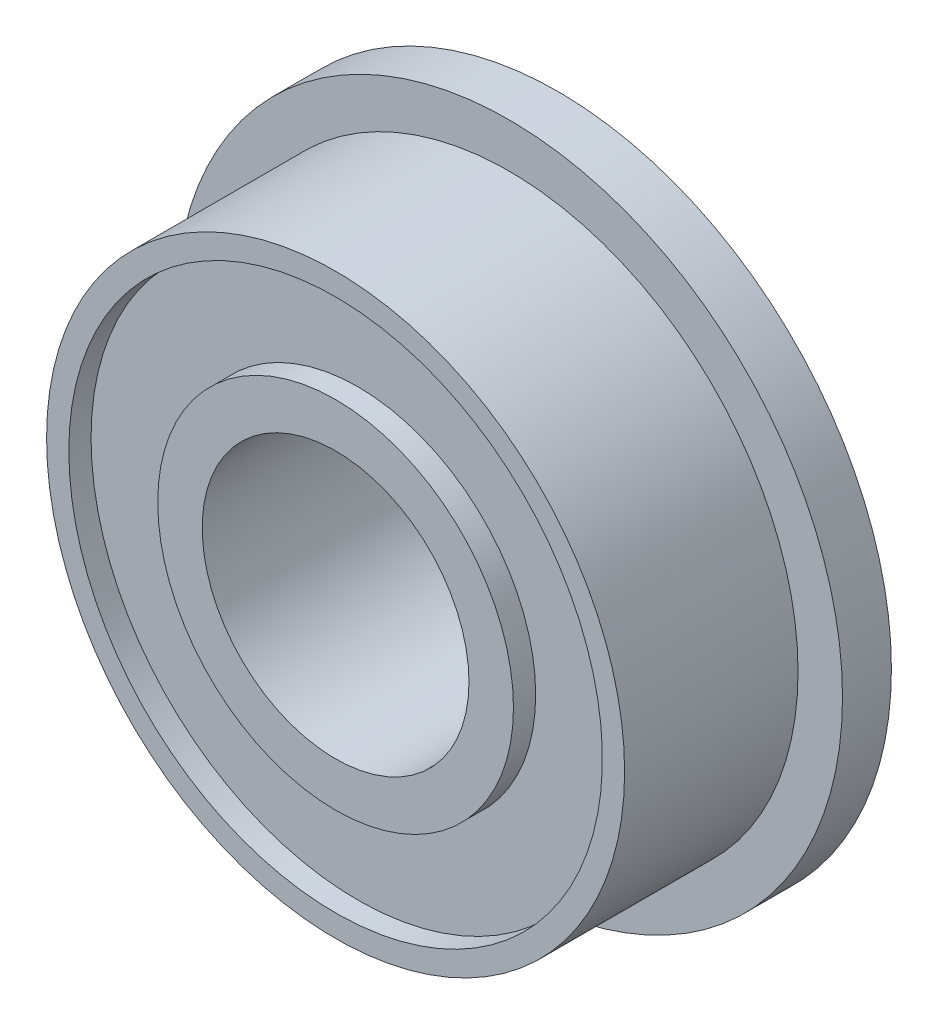
ISO-10303-21;
HEADER;
FILE_DESCRIPTION(('STEP AP214'),'2;1');
FILE_NAME('part.step','',(''),(''),'','','');
FILE_SCHEMA(('AUTOMOTIVE_DESIGN { 1 0 10303 214 1 1 1 1 }'));
ENDSEC;
DATA;
#1=APPLICATION_CONTEXT('core data for automotive mechanical design processes');
#2=APPLICATION_PROTOCOL_DEFINITION('international standard','automotive_design',2000,#1);
#3=PRODUCT_CONTEXT('',#1,'mechanical');
#4=PRODUCT('Part','Part','',(#3));
#5=PRODUCT_RELATED_PRODUCT_CATEGORY('part','',(#4));
#6=PRODUCT_DEFINITION_FORMATION('','',#4);
#7=PRODUCT_DEFINITION_CONTEXT('part definition',#1,'design');
#8=PRODUCT_DEFINITION('design','',#6,#7);
#9=PRODUCT_DEFINITION_SHAPE('','',#8);
#10=(LENGTH_UNIT() NAMED_UNIT(*) SI_UNIT(.MILLI.,.METRE.));
#11=(NAMED_UNIT(*) PLANE_ANGLE_UNIT() SI_UNIT($,.RADIAN.));
#12=(NAMED_UNIT(*) SI_UNIT($,.STERADIAN.) SOLID_ANGLE_UNIT());
#13=UNCERTAINTY_MEASURE_WITH_UNIT(LENGTH_MEASURE(1.E-05),#10,'distance_accuracy_value','');
#14=(GEOMETRIC_REPRESENTATION_CONTEXT(3) GLOBAL_UNCERTAINTY_ASSIGNED_CONTEXT((#13)) GLOBAL_UNIT_ASSIGNED_CONTEXT((#10,
#11,#12)) REPRESENTATION_CONTEXT('',''));
#15=CARTESIAN_POINT('',(0.,0.,0.));
#16=DIRECTION('',(0.,0.,1.));
#17=DIRECTION('',(1.,0.,0.));
#18=AXIS2_PLACEMENT_3D('',#15,#16,#17);
#19=CARTESIAN_POINT('',(0.,0.,5.));
#20=DIRECTION('',(0.,0.,1.));
#21=DIRECTION('',(1.,0.,0.));
#22=AXIS2_PLACEMENT_3D('',#19,#20,#21);
#23=PLANE('',#22);
#24=CARTESIAN_POINT('',(0.,0.,5.));
#25=DIRECTION('',(0.,0.,1.));
#26=DIRECTION('',(1.,0.,0.));
#27=AXIS2_PLACEMENT_3D('',#24,#25,#26);
#28=CIRCLE('',#27,3.);
#29=CARTESIAN_POINT('',(3.,0.,5.));
#30=VERTEX_POINT('',#29);
#31=EDGE_CURVE('E59',#30,#30,#28,.T.);
#32=ORIENTED_EDGE('',*,*,#31,.F.);
#33=EDGE_LOOP('',(#32));
#34=FACE_BOUND('',#33,.T.);
#35=CARTESIAN_POINT('',(0.,0.,5.));
#36=DIRECTION('',(0.,0.,-1.));
#37=DIRECTION('',(-1.,0.,0.));
#38=AXIS2_PLACEMENT_3D('',#35,#36,#37);
#39=CIRCLE('',#38,4.);
#40=CARTESIAN_POINT('',(-4.,0.,5.));
#41=VERTEX_POINT('',#40);
#42=EDGE_CURVE('E85',#41,#41,#39,.T.);
#43=ORIENTED_EDGE('',*,*,#42,.F.);
#44=EDGE_LOOP('',(#43));
#45=FACE_BOUND('',#44,.T.);
#46=ADVANCED_FACE('F36',(#34,#45),#23,.T.);
#47=CARTESIAN_POINT('',(0.,0.,0.));
#48=DIRECTION('',(0.,0.,1.));
#49=DIRECTION('',(1.,0.,0.));
#50=AXIS2_PLACEMENT_3D('',#47,#48,#49);
#51=PLANE('',#50);
#52=CARTESIAN_POINT('',(0.,0.,0.));
#53=DIRECTION('',(0.,0.,1.));
#54=DIRECTION('',(1.,0.,0.));
#55=AXIS2_PLACEMENT_3D('',#52,#53,#54);
#56=CIRCLE('',#55,3.);
#57=CARTESIAN_POINT('',(3.,0.,0.));
#58=VERTEX_POINT('',#57);
#59=EDGE_CURVE('E53',#58,#58,#56,.T.);
#60=ORIENTED_EDGE('',*,*,#59,.T.);
#61=EDGE_LOOP('',(#60));
#62=FACE_BOUND('',#61,.T.);
#63=CARTESIAN_POINT('',(0.,0.,0.));
#64=DIRECTION('',(0.,0.,-1.));
#65=DIRECTION('',(-1.,0.,0.));
#66=AXIS2_PLACEMENT_3D('',#63,#64,#65);
#67=CIRCLE('',#66,4.);
#68=CARTESIAN_POINT('',(-4.,0.,0.));
#69=VERTEX_POINT('',#68);
#70=EDGE_CURVE('E73',#69,#69,#67,.T.);
#71=ORIENTED_EDGE('',*,*,#70,.T.);
#72=EDGE_LOOP('',(#71));
#73=FACE_BOUND('',#72,.T.);
#74=ADVANCED_FACE('F101',(#62,#73),#51,.F.);
#75=CARTESIAN_POINT('',(0.,0.,1.1));
#76=DIRECTION('',(0.,0.,1.));
#77=DIRECTION('',(1.,0.,0.));
#78=AXIS2_PLACEMENT_3D('',#75,#76,#77);
#79=PLANE('',#78);
#80=CARTESIAN_POINT('',(0.,0.,1.1));
#81=DIRECTION('',(0.,0.,1.));
#82=DIRECTION('',(1.,0.,0.));
#83=AXIS2_PLACEMENT_3D('',#80,#81,#82);
#84=CIRCLE('',#83,6.5);
#85=CARTESIAN_POINT('',(6.5,0.,1.1));
#86=VERTEX_POINT('',#85);
#87=EDGE_CURVE('E10',#86,#86,#84,.T.);
#88=ORIENTED_EDGE('',*,*,#87,.F.);
#89=EDGE_LOOP('',(#88));
#90=FACE_BOUND('',#89,.T.);
#91=CARTESIAN_POINT('',(0.,0.,1.1));
#92=DIRECTION('',(0.,0.,1.));
#93=DIRECTION('',(1.,0.,0.));
#94=AXIS2_PLACEMENT_3D('',#91,#92,#93);
#95=CIRCLE('',#94,7.5);
#96=CARTESIAN_POINT('',(7.5,0.,1.1));
#97=VERTEX_POINT('',#96);
#98=EDGE_CURVE('E44',#97,#97,#95,.T.);
#99=ORIENTED_EDGE('',*,*,#98,.T.);
#100=EDGE_LOOP('',(#99));
#101=FACE_BOUND('',#100,.T.);
#102=ADVANCED_FACE('F108',(#90,#101),#79,.T.);
#103=CARTESIAN_POINT('',(0.,0.,0.));
#104=DIRECTION('',(0.,0.,-1.));
#105=DIRECTION('',(-1.,0.,0.));
#106=AXIS2_PLACEMENT_3D('',#103,#104,#105);
#107=CIRCLE('',#106,6.);
#108=CARTESIAN_POINT('',(-6.,0.,0.));
#109=VERTEX_POINT('',#108);
#110=EDGE_CURVE('E67',#109,#109,#107,.T.);
#111=ORIENTED_EDGE('',*,*,#110,.F.);
#112=EDGE_LOOP('',(#111));
#113=FACE_BOUND('',#112,.T.);
#114=CARTESIAN_POINT('',(0.,0.,0.));
#115=DIRECTION('',(0.,0.,1.));
#116=DIRECTION('',(1.,0.,0.));
#117=AXIS2_PLACEMENT_3D('',#114,#115,#116);
#118=CIRCLE('',#117,7.5);
#119=CARTESIAN_POINT('',(7.5,0.,0.));
#120=VERTEX_POINT('',#119);
#121=EDGE_CURVE('E40',#120,#120,#118,.T.);
#122=ORIENTED_EDGE('',*,*,#121,.F.);
#123=EDGE_LOOP('',(#122));
#124=FACE_BOUND('',#123,.T.);
#125=ADVANCED_FACE('F109',(#113,#124),#51,.F.);
#126=CARTESIAN_POINT('',(0.,0.,1.1));
#127=DIRECTION('',(0.,0.,-1.));
#128=DIRECTION('',(-1.,0.,0.));
#129=AXIS2_PLACEMENT_3D('',#126,#127,#128);
#130=CYLINDRICAL_SURFACE('',#129,7.5);
#131=ORIENTED_EDGE('',*,*,#98,.F.);
#132=EDGE_LOOP('',(#131));
#133=FACE_BOUND('',#132,.T.);
#134=ORIENTED_EDGE('',*,*,#121,.T.);
#135=EDGE_LOOP('',(#134));
#136=FACE_BOUND('',#135,.T.);
#137=ADVANCED_FACE('F38',(#133,#136),#130,.T.);
#138=CARTESIAN_POINT('',(0.,0.,1.1));
#139=DIRECTION('',(0.,0.,-1.));
#140=DIRECTION('',(-1.,0.,0.));
#141=AXIS2_PLACEMENT_3D('',#138,#139,#140);
#142=CYLINDRICAL_SURFACE('',#141,3.);
#143=ORIENTED_EDGE('',*,*,#59,.F.);
#144=EDGE_LOOP('',(#143));
#145=FACE_BOUND('',#144,.T.);
#146=ORIENTED_EDGE('',*,*,#31,.T.);
#147=EDGE_LOOP('',(#146));
#148=FACE_BOUND('',#147,.T.);
#149=ADVANCED_FACE('F114',(#145,#148),#142,.F.);
#150=CARTESIAN_POINT('',(0.,0.,5.));
#151=DIRECTION('',(0.,0.,-1.));
#152=DIRECTION('',(-1.,0.,0.));
#153=AXIS2_PLACEMENT_3D('',#150,#151,#152);
#154=CIRCLE('',#153,6.);
#155=CARTESIAN_POINT('',(-6.,0.,5.));
#156=VERTEX_POINT('',#155);
#157=EDGE_CURVE('E79',#156,#156,#154,.T.);
#158=ORIENTED_EDGE('',*,*,#157,.T.);
#159=EDGE_LOOP('',(#158));
#160=FACE_BOUND('',#159,.T.);
#161=CARTESIAN_POINT('',(0.,0.,5.));
#162=DIRECTION('',(0.,0.,1.));
#163=DIRECTION('',(1.,0.,0.));
#164=AXIS2_PLACEMENT_3D('',#161,#162,#163);
#165=CIRCLE('',#164,6.5);
#166=CARTESIAN_POINT('',(6.5,0.,5.));
#167=VERTEX_POINT('',#166);
#168=EDGE_CURVE('E51',#167,#167,#165,.T.);
#169=ORIENTED_EDGE('',*,*,#168,.T.);
#170=EDGE_LOOP('',(#169));
#171=FACE_BOUND('',#170,.T.);
#172=ADVANCED_FACE('F104',(#160,#171),#23,.T.);
#173=CARTESIAN_POINT('',(0.,0.,5.));
#174=DIRECTION('',(0.,0.,-1.));
#175=DIRECTION('',(-1.,0.,0.));
#176=AXIS2_PLACEMENT_3D('',#173,#174,#175);
#177=CYLINDRICAL_SURFACE('',#176,6.5);
#178=ORIENTED_EDGE('',*,*,#168,.F.);
#179=EDGE_LOOP('',(#178));
#180=FACE_BOUND('',#179,.T.);
#181=ORIENTED_EDGE('',*,*,#87,.T.);
#182=EDGE_LOOP('',(#181));
#183=FACE_BOUND('',#182,.T.);
#184=ADVANCED_FACE('F113',(#180,#183),#177,.T.);
#185=CARTESIAN_POINT('',(0.,0.,0.5));
#186=DIRECTION('',(0.,0.,-1.));
#187=DIRECTION('',(-1.,0.,0.));
#188=AXIS2_PLACEMENT_3D('',#185,#186,#187);
#189=CYLINDRICAL_SURFACE('',#188,6.);
#190=CARTESIAN_POINT('',(0.,0.,0.5));
#191=DIRECTION('',(0.,0.,-1.));
#192=DIRECTION('',(-1.,0.,0.));
#193=AXIS2_PLACEMENT_3D('',#190,#191,#192);
#194=CIRCLE('',#193,6.);
#195=CARTESIAN_POINT('',(-6.,0.,0.5));
#196=VERTEX_POINT('',#195);
#197=EDGE_CURVE('E63',#196,#196,#194,.T.);
#198=ORIENTED_EDGE('',*,*,#197,.F.);
#199=EDGE_LOOP('',(#198));
#200=FACE_BOUND('',#199,.T.);
#201=ORIENTED_EDGE('',*,*,#110,.T.);
#202=EDGE_LOOP('',(#201));
#203=FACE_BOUND('',#202,.T.);
#204=ADVANCED_FACE('F120',(#200,#203),#189,.F.);
#205=CARTESIAN_POINT('',(0.,0.,0.5));
#206=DIRECTION('',(0.,0.,-1.));
#207=DIRECTION('',(-1.,0.,0.));
#208=AXIS2_PLACEMENT_3D('',#205,#206,#207);
#209=PLANE('',#208);
#210=CARTESIAN_POINT('',(0.,0.,0.5));
#211=DIRECTION('',(0.,0.,-1.));
#212=DIRECTION('',(-1.,0.,0.));
#213=AXIS2_PLACEMENT_3D('',#210,#211,#212);
#214=CIRCLE('',#213,4.);
#215=CARTESIAN_POINT('',(-4.,0.,0.5));
#216=VERTEX_POINT('',#215);
#217=EDGE_CURVE('E71',#216,#216,#214,.T.);
#218=ORIENTED_EDGE('',*,*,#217,.F.);
#219=EDGE_LOOP('',(#218));
#220=FACE_BOUND('',#219,.T.);
#221=ORIENTED_EDGE('',*,*,#197,.T.);
#222=EDGE_LOOP('',(#221));
#223=FACE_BOUND('',#222,.T.);
#224=ADVANCED_FACE('F138',(#220,#223),#209,.T.);
#225=CARTESIAN_POINT('',(0.,0.,0.5));
#226=DIRECTION('',(0.,0.,-1.));
#227=DIRECTION('',(-1.,0.,0.));
#228=AXIS2_PLACEMENT_3D('',#225,#226,#227);
#229=CYLINDRICAL_SURFACE('',#228,4.);
#230=ORIENTED_EDGE('',*,*,#217,.T.);
#231=EDGE_LOOP('',(#230));
#232=FACE_BOUND('',#231,.T.);
#233=ORIENTED_EDGE('',*,*,#70,.F.);
#234=EDGE_LOOP('',(#233));
#235=FACE_BOUND('',#234,.T.);
#236=ADVANCED_FACE('F132',(#232,#235),#229,.T.);
#237=CARTESIAN_POINT('',(0.,0.,4.5));
#238=DIRECTION('',(0.,0.,1.));
#239=DIRECTION('',(-1.,0.,0.));
#240=AXIS2_PLACEMENT_3D('',#237,#238,#239);
#241=PLANE('',#240);
#242=CARTESIAN_POINT('',(0.,0.,4.5));
#243=DIRECTION('',(0.,0.,-1.));
#244=DIRECTION('',(-1.,0.,0.));
#245=AXIS2_PLACEMENT_3D('',#242,#243,#244);
#246=CIRCLE('',#245,6.);
#247=CARTESIAN_POINT('',(-6.,0.,4.5));
#248=VERTEX_POINT('',#247);
#249=EDGE_CURVE('E76',#248,#248,#246,.T.);
#250=ORIENTED_EDGE('',*,*,#249,.F.);
#251=EDGE_LOOP('',(#250));
#252=FACE_BOUND('',#251,.T.);
#253=CARTESIAN_POINT('',(0.,0.,4.5));
#254=DIRECTION('',(0.,0.,-1.));
#255=DIRECTION('',(-1.,0.,0.));
#256=AXIS2_PLACEMENT_3D('',#253,#254,#255);
#257=CIRCLE('',#256,4.);
#258=CARTESIAN_POINT('',(-4.,0.,4.5));
#259=VERTEX_POINT('',#258);
#260=EDGE_CURVE('E82',#259,#259,#257,.T.);
#261=ORIENTED_EDGE('',*,*,#260,.T.);
#262=EDGE_LOOP('',(#261));
#263=FACE_BOUND('',#262,.T.);
#264=ADVANCED_FACE('F91',(#252,#263),#241,.T.);
#265=CARTESIAN_POINT('',(0.,0.,4.5));
#266=DIRECTION('',(0.,0.,1.));
#267=DIRECTION('',(1.,0.,0.));
#268=AXIS2_PLACEMENT_3D('',#265,#266,#267);
#269=CYLINDRICAL_SURFACE('',#268,6.);
#270=ORIENTED_EDGE('',*,*,#249,.T.);
#271=EDGE_LOOP('',(#270));
#272=FACE_BOUND('',#271,.T.);
#273=ORIENTED_EDGE('',*,*,#157,.F.);
#274=EDGE_LOOP('',(#273));
#275=FACE_BOUND('',#274,.T.);
#276=ADVANCED_FACE('F96',(#272,#275),#269,.F.);
#277=CARTESIAN_POINT('',(0.,0.,4.5));
#278=DIRECTION('',(0.,0.,1.));
#279=DIRECTION('',(1.,0.,0.));
#280=AXIS2_PLACEMENT_3D('',#277,#278,#279);
#281=CYLINDRICAL_SURFACE('',#280,4.);
#282=ORIENTED_EDGE('',*,*,#260,.F.);
#283=EDGE_LOOP('',(#282));
#284=FACE_BOUND('',#283,.T.);
#285=ORIENTED_EDGE('',*,*,#42,.T.);
#286=EDGE_LOOP('',(#285));
#287=FACE_BOUND('',#286,.T.);
#288=ADVANCED_FACE('F93',(#284,#287),#281,.T.);
#289=CLOSED_SHELL('',(#46,#74,#102,#125,#137,#149,#172,#184,#204,#224,#236,#264,#276,#288));
#290=MANIFOLD_SOLID_BREP('B2',#289);
#291=ADVANCED_BREP_SHAPE_REPRESENTATION('',(#18,#290),#14);
#292=SHAPE_DEFINITION_REPRESENTATION(#9,#291);
ENDSEC;
END-ISO-10303-21;
